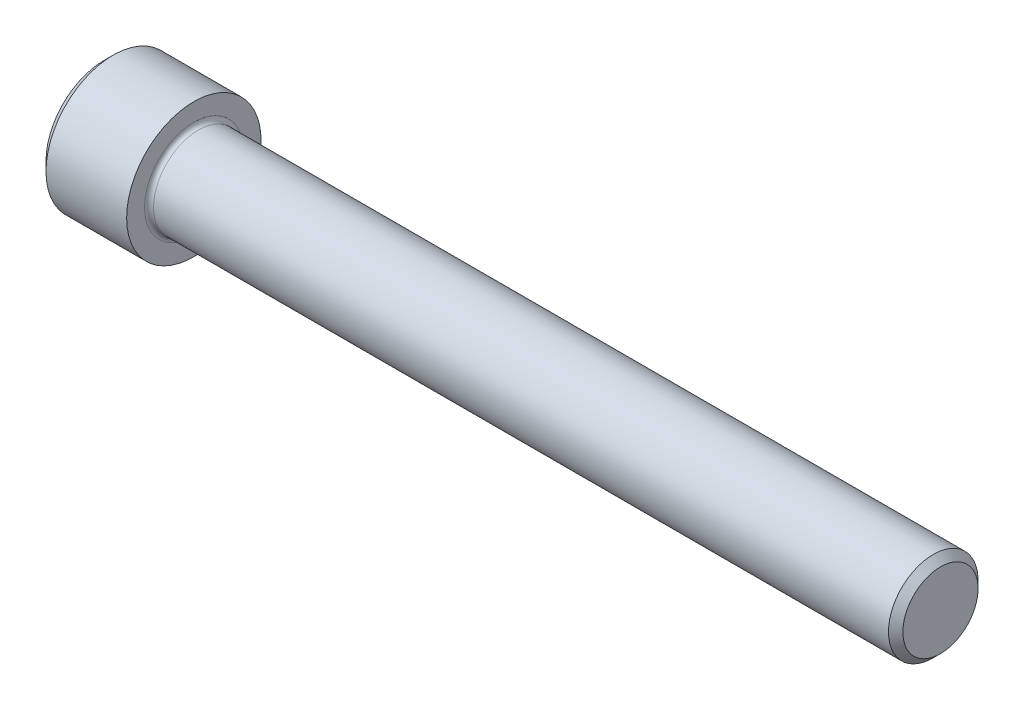
ISO-10303-21;
HEADER;
FILE_DESCRIPTION(('STEP AP214'),'2;1');
FILE_NAME('part.step','',(''),(''),'','','');
FILE_SCHEMA(('AUTOMOTIVE_DESIGN { 1 0 10303 214 1 1 1 1 }'));
ENDSEC;
DATA;
#1=APPLICATION_CONTEXT('core data for automotive mechanical design processes');
#2=APPLICATION_PROTOCOL_DEFINITION('international standard','automotive_design',2000,#1);
#3=PRODUCT_CONTEXT('',#1,'mechanical');
#4=PRODUCT('Part','Part','',(#3));
#5=PRODUCT_RELATED_PRODUCT_CATEGORY('part','',(#4));
#6=PRODUCT_DEFINITION_FORMATION('','',#4);
#7=PRODUCT_DEFINITION_CONTEXT('part definition',#1,'design');
#8=PRODUCT_DEFINITION('design','',#6,#7);
#9=PRODUCT_DEFINITION_SHAPE('','',#8);
#10=(LENGTH_UNIT() NAMED_UNIT(*) SI_UNIT(.MILLI.,.METRE.));
#11=(NAMED_UNIT(*) PLANE_ANGLE_UNIT() SI_UNIT($,.RADIAN.));
#12=(NAMED_UNIT(*) SI_UNIT($,.STERADIAN.) SOLID_ANGLE_UNIT());
#13=UNCERTAINTY_MEASURE_WITH_UNIT(LENGTH_MEASURE(1.E-05),#10,'distance_accuracy_value','');
#14=(GEOMETRIC_REPRESENTATION_CONTEXT(3) GLOBAL_UNCERTAINTY_ASSIGNED_CONTEXT((#13)) GLOBAL_UNIT_ASSIGNED_CONTEXT((#10,
#11,#12)) REPRESENTATION_CONTEXT('',''));
#15=CARTESIAN_POINT('',(0.,0.,0.));
#16=DIRECTION('',(0.,0.,1.));
#17=DIRECTION('',(1.,0.,0.));
#18=AXIS2_PLACEMENT_3D('',#15,#16,#17);
#19=CARTESIAN_POINT('',(0.,0.,0.));
#20=DIRECTION('',(-1.,0.,0.));
#21=DIRECTION('',(0.,0.,1.));
#22=AXIS2_PLACEMENT_3D('',#19,#20,#21);
#23=PLANE('',#22);
#24=DIRECTION('',(0.,-0.499999999999999,0.866025403784439));
#25=VECTOR('',#24,1.);
#26=CARTESIAN_POINT('',(0.,5.83989797285306,0.));
#27=LINE('',#26,#25);
#28=CARTESIAN_POINT('',(0.,5.83989797285306,0.));
#29=VERTEX_POINT('',#28);
#30=CARTESIAN_POINT('',(0.,2.91994898642653,5.05749999999999));
#31=VERTEX_POINT('',#30);
#32=EDGE_CURVE('E262',#29,#31,#27,.T.);
#33=ORIENTED_EDGE('',*,*,#32,.T.);
#34=DIRECTION('',(0.,1.,0.));
#35=VECTOR('',#34,1.);
#36=CARTESIAN_POINT('',(0.,-2.91994898642653,5.0575));
#37=LINE('',#36,#35);
#38=CARTESIAN_POINT('',(0.,-2.91994898642653,5.0575));
#39=VERTEX_POINT('',#38);
#40=EDGE_CURVE('E133',#39,#31,#37,.T.);
#41=ORIENTED_EDGE('',*,*,#40,.F.);
#42=DIRECTION('',(0.,-0.500000000000001,-0.866025403784438));
#43=VECTOR('',#42,1.);
#44=CARTESIAN_POINT('',(0.,-2.91994898642653,5.0575));
#45=LINE('',#44,#43);
#46=CARTESIAN_POINT('',(0.,-5.83989797285307,0.));
#47=VERTEX_POINT('',#46);
#48=EDGE_CURVE('E265',#39,#47,#45,.T.);
#49=ORIENTED_EDGE('',*,*,#48,.T.);
#50=DIRECTION('',(0.,0.499999999999999,-0.866025403784439));
#51=VECTOR('',#50,1.);
#52=CARTESIAN_POINT('',(0.,-5.83989797285307,0.));
#53=LINE('',#52,#51);
#54=CARTESIAN_POINT('',(0.,-2.91994898642654,-5.0575));
#55=VERTEX_POINT('',#54);
#56=EDGE_CURVE('E268',#47,#55,#53,.T.);
#57=ORIENTED_EDGE('',*,*,#56,.T.);
#58=DIRECTION('',(0.,-1.,0.));
#59=VECTOR('',#58,1.);
#60=CARTESIAN_POINT('',(0.,2.91994898642652,-5.0575));
#61=LINE('',#60,#59);
#62=CARTESIAN_POINT('',(0.,2.91994898642652,-5.0575));
#63=VERTEX_POINT('',#62);
#64=EDGE_CURVE('E271',#63,#55,#61,.T.);
#65=ORIENTED_EDGE('',*,*,#64,.F.);
#66=DIRECTION('',(0.,-0.500000000000001,-0.866025403784438));
#67=VECTOR('',#66,1.);
#68=CARTESIAN_POINT('',(0.,5.83989797285306,0.));
#69=LINE('',#68,#67);
#70=EDGE_CURVE('E128',#29,#63,#69,.T.);
#71=ORIENTED_EDGE('',*,*,#70,.F.);
#72=EDGE_LOOP('',(#33,#41,#49,#57,#65,#71));
#73=FACE_BOUND('',#72,.T.);
#74=CARTESIAN_POINT('',(0.,0.,0.));
#75=DIRECTION('',(-1.,0.,0.));
#76=DIRECTION('',(0.,0.,1.));
#77=AXIS2_PLACEMENT_3D('',#74,#75,#76);
#78=CIRCLE('',#77,7.8);
#79=CARTESIAN_POINT('',(0.,0.,7.8));
#80=VERTEX_POINT('',#79);
#81=EDGE_CURVE('E157',#80,#80,#78,.T.);
#82=ORIENTED_EDGE('',*,*,#81,.T.);
#83=EDGE_LOOP('',(#82));
#84=FACE_BOUND('',#83,.T.);
#85=ADVANCED_FACE('F37',(#73,#84),#23,.T.);
#86=CARTESIAN_POINT('',(0.,0.,0.));
#87=DIRECTION('',(1.,0.,0.));
#88=DIRECTION('',(0.,0.,-1.));
#89=AXIS2_PLACEMENT_3D('',#86,#87,#88);
#90=CONICAL_SURFACE('',#89,7.8,0.785398163397449);
#91=CARTESIAN_POINT('',(1.2,0.,0.));
#92=DIRECTION('',(-1.,0.,0.));
#93=DIRECTION('',(0.,0.,1.));
#94=AXIS2_PLACEMENT_3D('',#91,#92,#93);
#95=CIRCLE('',#94,9.);
#96=CARTESIAN_POINT('',(1.2,0.,9.));
#97=VERTEX_POINT('',#96);
#98=EDGE_CURVE('E154',#97,#97,#95,.T.);
#99=ORIENTED_EDGE('',*,*,#98,.T.);
#100=EDGE_LOOP('',(#99));
#101=FACE_BOUND('',#100,.T.);
#102=ORIENTED_EDGE('',*,*,#81,.F.);
#103=EDGE_LOOP('',(#102));
#104=FACE_BOUND('',#103,.T.);
#105=ADVANCED_FACE('F178',(#101,#104),#90,.T.);
#106=CARTESIAN_POINT('',(-31.75,0.,0.));
#107=DIRECTION('',(-1.,0.,0.));
#108=DIRECTION('',(0.,0.,1.));
#109=AXIS2_PLACEMENT_3D('',#106,#107,#108);
#110=CYLINDRICAL_SURFACE('',#109,9.);
#111=CARTESIAN_POINT('',(12.,0.,0.));
#112=DIRECTION('',(-1.,0.,0.));
#113=DIRECTION('',(0.,0.,1.));
#114=AXIS2_PLACEMENT_3D('',#111,#112,#113);
#115=CIRCLE('',#114,9.);
#116=CARTESIAN_POINT('',(12.,0.,9.));
#117=VERTEX_POINT('',#116);
#118=EDGE_CURVE('E151',#117,#117,#115,.T.);
#119=ORIENTED_EDGE('',*,*,#118,.T.);
#120=EDGE_LOOP('',(#119));
#121=FACE_BOUND('',#120,.T.);
#122=ORIENTED_EDGE('',*,*,#98,.F.);
#123=EDGE_LOOP('',(#122));
#124=FACE_BOUND('',#123,.T.);
#125=ADVANCED_FACE('F183',(#121,#124),#110,.T.);
#126=CARTESIAN_POINT('',(12.,9.,0.));
#127=DIRECTION('',(1.,0.,0.));
#128=DIRECTION('',(0.,0.,-1.));
#129=AXIS2_PLACEMENT_3D('',#126,#127,#128);
#130=PLANE('',#129);
#131=CARTESIAN_POINT('',(12.,0.,0.));
#132=DIRECTION('',(1.,0.,0.));
#133=DIRECTION('',(0.,0.,-1.));
#134=AXIS2_PLACEMENT_3D('',#131,#132,#133);
#135=CIRCLE('',#134,6.59999999999998);
#136=CARTESIAN_POINT('',(12.,0.,-6.59999999999998));
#137=VERTEX_POINT('',#136);
#138=EDGE_CURVE('E45',#137,#137,#135,.F.);
#139=ORIENTED_EDGE('',*,*,#138,.T.);
#140=EDGE_LOOP('',(#139));
#141=FACE_BOUND('',#140,.T.);
#142=ORIENTED_EDGE('',*,*,#118,.F.);
#143=EDGE_LOOP('',(#142));
#144=FACE_BOUND('',#143,.T.);
#145=ADVANCED_FACE('F162',(#141,#144),#130,.T.);
#146=CARTESIAN_POINT('',(-31.75,0.,0.));
#147=DIRECTION('',(-1.,0.,0.));
#148=DIRECTION('',(0.,0.,1.));
#149=AXIS2_PLACEMENT_3D('',#146,#147,#148);
#150=CYLINDRICAL_SURFACE('',#149,5.99999999999998);
#151=CARTESIAN_POINT('',(12.6,0.,0.));
#152=DIRECTION('',(1.,0.,0.));
#153=DIRECTION('',(0.,0.,-1.));
#154=AXIS2_PLACEMENT_3D('',#151,#152,#153);
#155=CIRCLE('',#154,5.99999999999998);
#156=CARTESIAN_POINT('',(12.6,0.,-5.99999999999998));
#157=VERTEX_POINT('',#156);
#158=EDGE_CURVE('E11',#157,#157,#155,.T.);
#159=ORIENTED_EDGE('',*,*,#158,.T.);
#160=EDGE_LOOP('',(#159));
#161=FACE_BOUND('',#160,.T.);
#162=CARTESIAN_POINT('',(111.036,0.,0.));
#163=DIRECTION('',(-1.,0.,0.));
#164=DIRECTION('',(0.,0.,1.));
#165=AXIS2_PLACEMENT_3D('',#162,#163,#164);
#166=CIRCLE('',#165,5.99999999999997);
#167=CARTESIAN_POINT('',(111.036,0.,5.99999999999997));
#168=VERTEX_POINT('',#167);
#169=EDGE_CURVE('E148',#168,#168,#166,.T.);
#170=ORIENTED_EDGE('',*,*,#169,.T.);
#171=EDGE_LOOP('',(#170));
#172=FACE_BOUND('',#171,.T.);
#173=ADVANCED_FACE('F193',(#161,#172),#150,.T.);
#174=CARTESIAN_POINT('',(112.,0.,0.));
#175=DIRECTION('',(-1.,0.,0.));
#176=DIRECTION('',(0.,0.,1.));
#177=AXIS2_PLACEMENT_3D('',#174,#175,#176);
#178=CONICAL_SURFACE('',#177,5.036,0.785398163397408);
#179=ORIENTED_EDGE('',*,*,#169,.F.);
#180=EDGE_LOOP('',(#179));
#181=FACE_BOUND('',#180,.T.);
#182=CARTESIAN_POINT('',(112.,0.,0.));
#183=DIRECTION('',(-1.,0.,0.));
#184=DIRECTION('',(0.,0.,1.));
#185=AXIS2_PLACEMENT_3D('',#182,#183,#184);
#186=CIRCLE('',#185,5.036);
#187=CARTESIAN_POINT('',(112.,0.,5.036));
#188=VERTEX_POINT('',#187);
#189=EDGE_CURVE('E144',#188,#188,#186,.T.);
#190=ORIENTED_EDGE('',*,*,#189,.T.);
#191=EDGE_LOOP('',(#190));
#192=FACE_BOUND('',#191,.T.);
#193=ADVANCED_FACE('F173',(#181,#192),#178,.T.);
#194=CARTESIAN_POINT('',(112.,5.036,0.));
#195=DIRECTION('',(1.,0.,0.));
#196=DIRECTION('',(0.,0.,-1.));
#197=AXIS2_PLACEMENT_3D('',#194,#195,#196);
#198=PLANE('',#197);
#199=ORIENTED_EDGE('',*,*,#189,.F.);
#200=EDGE_LOOP('',(#199));
#201=FACE_BOUND('',#200,.T.);
#202=ADVANCED_FACE('F166',(#201),#198,.T.);
#203=CARTESIAN_POINT('',(12.6,0.,0.));
#204=DIRECTION('',(1.,0.,0.));
#205=DIRECTION('',(0.,0.,-1.));
#206=AXIS2_PLACEMENT_3D('',#203,#204,#205);
#207=TOROIDAL_SURFACE('',#206,6.59999999999998,0.6);
#208=ORIENTED_EDGE('',*,*,#158,.F.);
#209=EDGE_LOOP('',(#208));
#210=FACE_BOUND('',#209,.T.);
#211=ORIENTED_EDGE('',*,*,#138,.F.);
#212=EDGE_LOOP('',(#211));
#213=FACE_BOUND('',#212,.T.);
#214=ADVANCED_FACE('F39',(#210,#213),#207,.F.);
#215=CARTESIAN_POINT('',(6.,5.83989797285306,0.));
#216=DIRECTION('',(0.,-0.866025403784439,-0.499999999999999));
#217=DIRECTION('',(0.,0.499999999999999,-0.866025403784439));
#218=AXIS2_PLACEMENT_3D('',#215,#216,#217);
#219=PLANE('',#218);
#220=ORIENTED_EDGE('',*,*,#32,.F.);
#221=DIRECTION('',(-1.,0.,0.));
#222=VECTOR('',#221,1.);
#223=CARTESIAN_POINT('',(6.,5.83989797285306,0.));
#224=LINE('',#223,#222);
#225=CARTESIAN_POINT('',(6.,5.83989797285306,0.));
#226=VERTEX_POINT('',#225);
#227=EDGE_CURVE('E252',#226,#29,#224,.T.);
#228=ORIENTED_EDGE('',*,*,#227,.F.);
#229=DIRECTION('',(0.,-0.499999999999999,0.866025403784439));
#230=VECTOR('',#229,1.);
#231=CARTESIAN_POINT('',(6.,5.83989797285306,0.));
#232=LINE('',#231,#230);
#233=CARTESIAN_POINT('',(6.,4.3799234796398,2.52874999999999));
#234=VERTEX_POINT('',#233);
#235=EDGE_CURVE('E120',#226,#234,#232,.T.);
#236=ORIENTED_EDGE('',*,*,#235,.T.);
#237=CARTESIAN_POINT('',(6.,2.91994898642653,5.05749999999999));
#238=VERTEX_POINT('',#237);
#239=EDGE_CURVE('E111',#234,#238,#232,.T.);
#240=ORIENTED_EDGE('',*,*,#239,.T.);
#241=DIRECTION('',(-1.,0.,0.));
#242=VECTOR('',#241,1.);
#243=CARTESIAN_POINT('',(6.,2.91994898642653,5.05749999999999));
#244=LINE('',#243,#242);
#245=EDGE_CURVE('E125',#238,#31,#244,.T.);
#246=ORIENTED_EDGE('',*,*,#245,.T.);
#247=EDGE_LOOP('',(#220,#228,#236,#240,#246));
#248=FACE_BOUND('',#247,.T.);
#249=ADVANCED_FACE('F124',(#248),#219,.T.);
#250=CARTESIAN_POINT('',(6.,-2.91994898642653,5.0575));
#251=DIRECTION('',(0.,0.,1.));
#252=DIRECTION('',(0.,-1.,0.));
#253=AXIS2_PLACEMENT_3D('',#250,#251,#252);
#254=PLANE('',#253);
#255=ORIENTED_EDGE('',*,*,#40,.T.);
#256=ORIENTED_EDGE('',*,*,#245,.F.);
#257=DIRECTION('',(0.,1.,0.));
#258=VECTOR('',#257,1.);
#259=CARTESIAN_POINT('',(6.,-2.91994898642653,5.0575));
#260=LINE('',#259,#258);
#261=CARTESIAN_POINT('',(6.,0.,5.0575));
#262=VERTEX_POINT('',#261);
#263=EDGE_CURVE('E108',#262,#238,#260,.T.);
#264=ORIENTED_EDGE('',*,*,#263,.F.);
#265=CARTESIAN_POINT('',(6.,-2.91994898642653,5.0575));
#266=VERTEX_POINT('',#265);
#267=EDGE_CURVE('E119',#266,#262,#260,.T.);
#268=ORIENTED_EDGE('',*,*,#267,.F.);
#269=DIRECTION('',(-1.,0.,0.));
#270=VECTOR('',#269,1.);
#271=CARTESIAN_POINT('',(6.,-2.91994898642653,5.0575));
#272=LINE('',#271,#270);
#273=EDGE_CURVE('E135',#266,#39,#272,.T.);
#274=ORIENTED_EDGE('',*,*,#273,.T.);
#275=EDGE_LOOP('',(#255,#256,#264,#268,#274));
#276=FACE_BOUND('',#275,.T.);
#277=ADVANCED_FACE('F130',(#276),#254,.F.);
#278=CARTESIAN_POINT('',(6.,-2.91994898642653,5.0575));
#279=DIRECTION('',(0.,0.866025403784438,-0.500000000000001));
#280=DIRECTION('',(0.,0.500000000000001,0.866025403784438));
#281=AXIS2_PLACEMENT_3D('',#278,#279,#280);
#282=PLANE('',#281);
#283=ORIENTED_EDGE('',*,*,#48,.F.);
#284=ORIENTED_EDGE('',*,*,#273,.F.);
#285=DIRECTION('',(0.,-0.500000000000001,-0.866025403784438));
#286=VECTOR('',#285,1.);
#287=CARTESIAN_POINT('',(6.,-2.91994898642653,5.0575));
#288=LINE('',#287,#286);
#289=CARTESIAN_POINT('',(6.,-4.3799234796398,2.52875000000001));
#290=VERTEX_POINT('',#289);
#291=EDGE_CURVE('E291',#266,#290,#288,.T.);
#292=ORIENTED_EDGE('',*,*,#291,.T.);
#293=CARTESIAN_POINT('',(6.,-5.83989797285307,0.));
#294=VERTEX_POINT('',#293);
#295=EDGE_CURVE('E280',#290,#294,#288,.T.);
#296=ORIENTED_EDGE('',*,*,#295,.T.);
#297=DIRECTION('',(-1.,0.,0.));
#298=VECTOR('',#297,1.);
#299=CARTESIAN_POINT('',(6.,-5.83989797285307,0.));
#300=LINE('',#299,#298);
#301=EDGE_CURVE('E140',#294,#47,#300,.T.);
#302=ORIENTED_EDGE('',*,*,#301,.T.);
#303=EDGE_LOOP('',(#283,#284,#292,#296,#302));
#304=FACE_BOUND('',#303,.T.);
#305=ADVANCED_FACE('F206',(#304),#282,.T.);
#306=CARTESIAN_POINT('',(6.,-5.83989797285307,0.));
#307=DIRECTION('',(0.,0.866025403784439,0.499999999999999));
#308=DIRECTION('',(0.,-0.499999999999999,0.866025403784439));
#309=AXIS2_PLACEMENT_3D('',#306,#307,#308);
#310=PLANE('',#309);
#311=ORIENTED_EDGE('',*,*,#56,.F.);
#312=ORIENTED_EDGE('',*,*,#301,.F.);
#313=DIRECTION('',(0.,0.499999999999999,-0.866025403784439));
#314=VECTOR('',#313,1.);
#315=CARTESIAN_POINT('',(6.,-5.83989797285307,0.));
#316=LINE('',#315,#314);
#317=CARTESIAN_POINT('',(6.,-4.3799234796398,-2.52875));
#318=VERTEX_POINT('',#317);
#319=EDGE_CURVE('E258',#294,#318,#316,.T.);
#320=ORIENTED_EDGE('',*,*,#319,.T.);
#321=CARTESIAN_POINT('',(6.,-2.91994898642654,-5.0575));
#322=VERTEX_POINT('',#321);
#323=EDGE_CURVE('E290',#318,#322,#316,.T.);
#324=ORIENTED_EDGE('',*,*,#323,.T.);
#325=DIRECTION('',(-1.,0.,0.));
#326=VECTOR('',#325,1.);
#327=CARTESIAN_POINT('',(6.,-2.91994898642654,-5.0575));
#328=LINE('',#327,#326);
#329=EDGE_CURVE('E251',#322,#55,#328,.T.);
#330=ORIENTED_EDGE('',*,*,#329,.T.);
#331=EDGE_LOOP('',(#311,#312,#320,#324,#330));
#332=FACE_BOUND('',#331,.T.);
#333=ADVANCED_FACE('F209',(#332),#310,.T.);
#334=CARTESIAN_POINT('',(6.,2.91994898642652,-5.0575));
#335=DIRECTION('',(0.,0.,-1.));
#336=DIRECTION('',(0.,1.,0.));
#337=AXIS2_PLACEMENT_3D('',#334,#335,#336);
#338=PLANE('',#337);
#339=ORIENTED_EDGE('',*,*,#64,.T.);
#340=ORIENTED_EDGE('',*,*,#329,.F.);
#341=DIRECTION('',(0.,-1.,0.));
#342=VECTOR('',#341,1.);
#343=CARTESIAN_POINT('',(6.,2.91994898642652,-5.0575));
#344=LINE('',#343,#342);
#345=CARTESIAN_POINT('',(6.,0.,-5.0575));
#346=VERTEX_POINT('',#345);
#347=EDGE_CURVE('E255',#346,#322,#344,.T.);
#348=ORIENTED_EDGE('',*,*,#347,.F.);
#349=CARTESIAN_POINT('',(6.,2.91994898642652,-5.0575));
#350=VERTEX_POINT('',#349);
#351=EDGE_CURVE('E52',#350,#346,#344,.T.);
#352=ORIENTED_EDGE('',*,*,#351,.F.);
#353=DIRECTION('',(-1.,0.,0.));
#354=VECTOR('',#353,1.);
#355=CARTESIAN_POINT('',(6.,2.91994898642652,-5.0575));
#356=LINE('',#355,#354);
#357=EDGE_CURVE('E248',#350,#63,#356,.T.);
#358=ORIENTED_EDGE('',*,*,#357,.T.);
#359=EDGE_LOOP('',(#339,#340,#348,#352,#358));
#360=FACE_BOUND('',#359,.T.);
#361=ADVANCED_FACE('F213',(#360),#338,.F.);
#362=CARTESIAN_POINT('',(6.,5.83989797285306,0.));
#363=DIRECTION('',(0.,0.866025403784438,-0.500000000000001));
#364=DIRECTION('',(0.,0.500000000000001,0.866025403784438));
#365=AXIS2_PLACEMENT_3D('',#362,#363,#364);
#366=PLANE('',#365);
#367=ORIENTED_EDGE('',*,*,#70,.T.);
#368=ORIENTED_EDGE('',*,*,#357,.F.);
#369=DIRECTION('',(0.,-0.500000000000001,-0.866025403784438));
#370=VECTOR('',#369,1.);
#371=CARTESIAN_POINT('',(6.,5.83989797285306,0.));
#372=LINE('',#371,#370);
#373=CARTESIAN_POINT('',(6.,4.37992347963979,-2.52875));
#374=VERTEX_POINT('',#373);
#375=EDGE_CURVE('E238',#374,#350,#372,.T.);
#376=ORIENTED_EDGE('',*,*,#375,.F.);
#377=EDGE_CURVE('E244',#226,#374,#372,.T.);
#378=ORIENTED_EDGE('',*,*,#377,.F.);
#379=ORIENTED_EDGE('',*,*,#227,.T.);
#380=EDGE_LOOP('',(#367,#368,#376,#378,#379));
#381=FACE_BOUND('',#380,.T.);
#382=ADVANCED_FACE('F217',(#381),#366,.F.);
#383=CARTESIAN_POINT('',(6.,5.83989797285306,0.));
#384=DIRECTION('',(1.,0.,0.));
#385=DIRECTION('',(0.,0.,-1.));
#386=AXIS2_PLACEMENT_3D('',#383,#384,#385);
#387=PLANE('',#386);
#388=ORIENTED_EDGE('',*,*,#347,.T.);
#389=ORIENTED_EDGE('',*,*,#323,.F.);
#390=CARTESIAN_POINT('',(6.,0.,0.));
#391=DIRECTION('',(-1.,0.,0.));
#392=DIRECTION('',(0.,0.,1.));
#393=AXIS2_PLACEMENT_3D('',#390,#391,#392);
#394=CIRCLE('',#393,5.0575);
#395=EDGE_CURVE('E286',#346,#318,#394,.T.);
#396=ORIENTED_EDGE('',*,*,#395,.F.);
#397=EDGE_LOOP('',(#388,#389,#396));
#398=FACE_BOUND('',#397,.T.);
#399=ADVANCED_FACE('F221',(#398),#387,.F.);
#400=ORIENTED_EDGE('',*,*,#319,.F.);
#401=ORIENTED_EDGE('',*,*,#295,.F.);
#402=EDGE_CURVE('E138',#318,#290,#394,.T.);
#403=ORIENTED_EDGE('',*,*,#402,.F.);
#404=EDGE_LOOP('',(#400,#401,#403));
#405=FACE_BOUND('',#404,.T.);
#406=ADVANCED_FACE('F224',(#405),#387,.F.);
#407=ORIENTED_EDGE('',*,*,#291,.F.);
#408=ORIENTED_EDGE('',*,*,#267,.T.);
#409=EDGE_CURVE('E134',#290,#262,#394,.T.);
#410=ORIENTED_EDGE('',*,*,#409,.F.);
#411=EDGE_LOOP('',(#407,#408,#410));
#412=FACE_BOUND('',#411,.T.);
#413=ADVANCED_FACE('F229',(#412),#387,.F.);
#414=ORIENTED_EDGE('',*,*,#263,.T.);
#415=ORIENTED_EDGE('',*,*,#239,.F.);
#416=EDGE_CURVE('E114',#262,#234,#394,.T.);
#417=ORIENTED_EDGE('',*,*,#416,.F.);
#418=EDGE_LOOP('',(#414,#415,#417));
#419=FACE_BOUND('',#418,.T.);
#420=ADVANCED_FACE('F110',(#419),#387,.F.);
#421=ORIENTED_EDGE('',*,*,#235,.F.);
#422=ORIENTED_EDGE('',*,*,#377,.T.);
#423=EDGE_CURVE('E145',#234,#374,#394,.T.);
#424=ORIENTED_EDGE('',*,*,#423,.F.);
#425=EDGE_LOOP('',(#421,#422,#424));
#426=FACE_BOUND('',#425,.T.);
#427=ADVANCED_FACE('F232',(#426),#387,.F.);
#428=ORIENTED_EDGE('',*,*,#375,.T.);
#429=ORIENTED_EDGE('',*,*,#351,.T.);
#430=EDGE_CURVE('E241',#374,#346,#394,.T.);
#431=ORIENTED_EDGE('',*,*,#430,.F.);
#432=EDGE_LOOP('',(#428,#429,#431));
#433=FACE_BOUND('',#432,.T.);
#434=ADVANCED_FACE('F202',(#433),#387,.F.);
#435=CARTESIAN_POINT('',(6.,0.,0.));
#436=DIRECTION('',(-1.,0.,0.));
#437=DIRECTION('',(0.,0.,1.));
#438=AXIS2_PLACEMENT_3D('',#435,#436,#437);
#439=CONICAL_SURFACE('',#438,5.0575,1.04719755119659);
#440=CARTESIAN_POINT('',(8.91994898642658,0.,0.));
#441=VERTEX_POINT('',#440);
#442=VERTEX_LOOP('',#441);
#443=FACE_BOUND('',#442,.T.);
#444=ORIENTED_EDGE('',*,*,#416,.T.);
#445=ORIENTED_EDGE('',*,*,#423,.T.);
#446=ORIENTED_EDGE('',*,*,#430,.T.);
#447=ORIENTED_EDGE('',*,*,#395,.T.);
#448=ORIENTED_EDGE('',*,*,#402,.T.);
#449=ORIENTED_EDGE('',*,*,#409,.T.);
#450=EDGE_LOOP('',(#444,#445,#446,#447,#448,#449));
#451=FACE_BOUND('',#450,.T.);
#452=ADVANCED_FACE('F200',(#443,#451),#439,.F.);
#453=CLOSED_SHELL('',(#85,#105,#125,#145,#173,#193,#202,#214,#249,#277,#305,#333,#361,#382,#399,
#406,#413,#420,#427,#434,#452));
#454=MANIFOLD_SOLID_BREP('B2',#453);
#455=ADVANCED_BREP_SHAPE_REPRESENTATION('',(#18,#454),#14);
#456=SHAPE_DEFINITION_REPRESENTATION(#9,#455);
ENDSEC;
END-ISO-10303-21;
